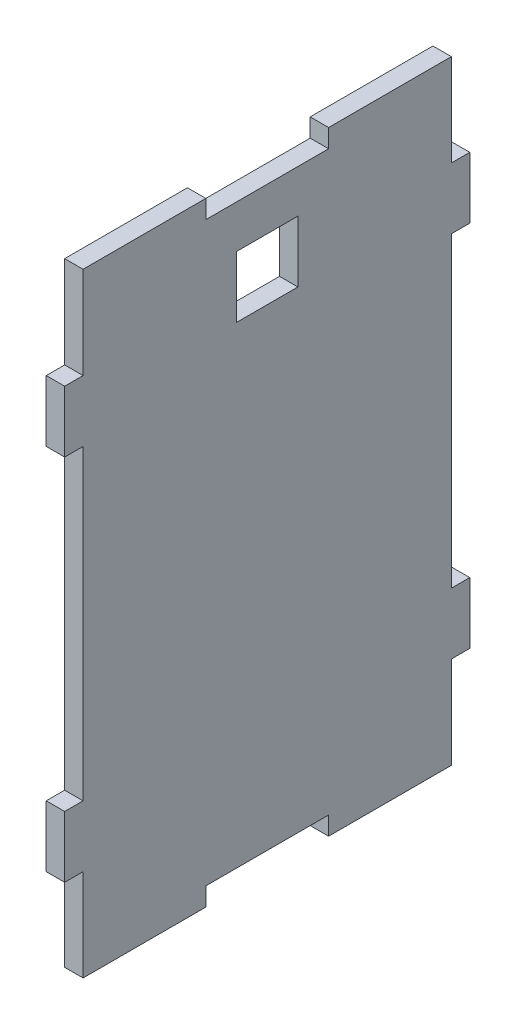
ISO-10303-21;
HEADER;
FILE_DESCRIPTION(('STEP AP214'),'2;1');
FILE_NAME('part.step','',(''),(''),'','','');
FILE_SCHEMA(('AUTOMOTIVE_DESIGN { 1 0 10303 214 1 1 1 1 }'));
ENDSEC;
DATA;
#1=APPLICATION_CONTEXT('core data for automotive mechanical design processes');
#2=APPLICATION_PROTOCOL_DEFINITION('international standard','automotive_design',2000,#1);
#3=PRODUCT_CONTEXT('',#1,'mechanical');
#4=PRODUCT('Part','Part','',(#3));
#5=PRODUCT_RELATED_PRODUCT_CATEGORY('part','',(#4));
#6=PRODUCT_DEFINITION_FORMATION('','',#4);
#7=PRODUCT_DEFINITION_CONTEXT('part definition',#1,'design');
#8=PRODUCT_DEFINITION('design','',#6,#7);
#9=PRODUCT_DEFINITION_SHAPE('','',#8);
#10=(LENGTH_UNIT() NAMED_UNIT(*) SI_UNIT(.MILLI.,.METRE.));
#11=(NAMED_UNIT(*) PLANE_ANGLE_UNIT() SI_UNIT($,.RADIAN.));
#12=(NAMED_UNIT(*) SI_UNIT($,.STERADIAN.) SOLID_ANGLE_UNIT());
#13=UNCERTAINTY_MEASURE_WITH_UNIT(LENGTH_MEASURE(1.E-05),#10,'distance_accuracy_value','');
#14=(GEOMETRIC_REPRESENTATION_CONTEXT(3) GLOBAL_UNCERTAINTY_ASSIGNED_CONTEXT((#13)) GLOBAL_UNIT_ASSIGNED_CONTEXT((#10,
#11,#12)) REPRESENTATION_CONTEXT('',''));
#15=CARTESIAN_POINT('',(0.,0.,0.));
#16=DIRECTION('',(0.,0.,1.));
#17=DIRECTION('',(1.,0.,0.));
#18=AXIS2_PLACEMENT_3D('',#15,#16,#17);
#19=CARTESIAN_POINT('',(3.,50.,30.));
#20=DIRECTION('',(0.,-1.,0.));
#21=DIRECTION('',(0.,0.,-1.));
#22=AXIS2_PLACEMENT_3D('',#19,#20,#21);
#23=PLANE('',#22);
#24=DIRECTION('',(0.,0.,1.));
#25=VECTOR('',#24,1.);
#26=CARTESIAN_POINT('',(0.,50.,30.));
#27=LINE('',#26,#25);
#28=CARTESIAN_POINT('',(0.,50.,-30.));
#29=VERTEX_POINT('',#28);
#30=CARTESIAN_POINT('',(0.,50.,-10.));
#31=VERTEX_POINT('',#30);
#32=EDGE_CURVE('E537',#29,#31,#27,.T.);
#33=ORIENTED_EDGE('',*,*,#32,.T.);
#34=DIRECTION('',(1.,0.,0.));
#35=VECTOR('',#34,1.);
#36=CARTESIAN_POINT('',(0.,50.,-10.));
#37=LINE('',#36,#35);
#38=CARTESIAN_POINT('',(3.,50.,-10.));
#39=VERTEX_POINT('',#38);
#40=EDGE_CURVE('E322',#31,#39,#37,.T.);
#41=ORIENTED_EDGE('',*,*,#40,.T.);
#42=DIRECTION('',(0.,0.,1.));
#43=VECTOR('',#42,1.);
#44=CARTESIAN_POINT('',(3.,50.,30.));
#45=LINE('',#44,#43);
#46=CARTESIAN_POINT('',(3.,50.,-30.));
#47=VERTEX_POINT('',#46);
#48=EDGE_CURVE('E516',#47,#39,#45,.T.);
#49=ORIENTED_EDGE('',*,*,#48,.F.);
#50=DIRECTION('',(-1.,0.,0.));
#51=VECTOR('',#50,1.);
#52=CARTESIAN_POINT('',(3.,50.,-30.));
#53=LINE('',#52,#51);
#54=EDGE_CURVE('E11',#47,#29,#53,.T.);
#55=ORIENTED_EDGE('',*,*,#54,.T.);
#56=EDGE_LOOP('',(#33,#41,#49,#55));
#57=FACE_BOUND('',#56,.T.);
#58=ADVANCED_FACE('F38',(#57),#23,.F.);
#59=CARTESIAN_POINT('',(3.,-50.,30.));
#60=DIRECTION('',(0.,1.,0.));
#61=DIRECTION('',(0.,0.,1.));
#62=AXIS2_PLACEMENT_3D('',#59,#60,#61);
#63=PLANE('',#62);
#64=DIRECTION('',(0.,0.,-1.));
#65=VECTOR('',#64,1.);
#66=CARTESIAN_POINT('',(0.,-50.,30.));
#67=LINE('',#66,#65);
#68=CARTESIAN_POINT('',(0.,-50.,30.));
#69=VERTEX_POINT('',#68);
#70=CARTESIAN_POINT('',(0.,-50.,10.));
#71=VERTEX_POINT('',#70);
#72=EDGE_CURVE('E547',#69,#71,#67,.T.);
#73=ORIENTED_EDGE('',*,*,#72,.T.);
#74=DIRECTION('',(1.,0.,0.));
#75=VECTOR('',#74,1.);
#76=CARTESIAN_POINT('',(0.,-50.,10.));
#77=LINE('',#76,#75);
#78=CARTESIAN_POINT('',(3.,-50.,10.));
#79=VERTEX_POINT('',#78);
#80=EDGE_CURVE('E316',#71,#79,#77,.T.);
#81=ORIENTED_EDGE('',*,*,#80,.T.);
#82=DIRECTION('',(0.,0.,-1.));
#83=VECTOR('',#82,1.);
#84=CARTESIAN_POINT('',(3.,-50.,30.));
#85=LINE('',#84,#83);
#86=CARTESIAN_POINT('',(3.,-50.,30.));
#87=VERTEX_POINT('',#86);
#88=EDGE_CURVE('E527',#87,#79,#85,.T.);
#89=ORIENTED_EDGE('',*,*,#88,.F.);
#90=DIRECTION('',(-1.,0.,0.));
#91=VECTOR('',#90,1.);
#92=CARTESIAN_POINT('',(3.,-50.,30.));
#93=LINE('',#92,#91);
#94=EDGE_CURVE('E554',#87,#69,#93,.T.);
#95=ORIENTED_EDGE('',*,*,#94,.T.);
#96=EDGE_LOOP('',(#73,#81,#89,#95));
#97=FACE_BOUND('',#96,.T.);
#98=ADVANCED_FACE('F654',(#97),#63,.F.);
#99=CARTESIAN_POINT('',(3.,50.,-30.));
#100=DIRECTION('',(0.,0.,1.));
#101=DIRECTION('',(0.,-1.,0.));
#102=AXIS2_PLACEMENT_3D('',#99,#100,#101);
#103=PLANE('',#102);
#104=DIRECTION('',(-1.,0.,0.));
#105=VECTOR('',#104,1.);
#106=CARTESIAN_POINT('',(3.,-35.,-30.));
#107=LINE('',#106,#105);
#108=CARTESIAN_POINT('',(3.,-35.,-30.));
#109=VERTEX_POINT('',#108);
#110=CARTESIAN_POINT('',(0.,-35.,-30.));
#111=VERTEX_POINT('',#110);
#112=EDGE_CURVE('E400',#109,#111,#107,.T.);
#113=ORIENTED_EDGE('',*,*,#112,.F.);
#114=DIRECTION('',(0.,1.,0.));
#115=VECTOR('',#114,1.);
#116=CARTESIAN_POINT('',(3.,50.,-30.));
#117=LINE('',#116,#115);
#118=CARTESIAN_POINT('',(3.,-50.,-30.));
#119=VERTEX_POINT('',#118);
#120=EDGE_CURVE('E509',#119,#109,#117,.T.);
#121=ORIENTED_EDGE('',*,*,#120,.F.);
#122=DIRECTION('',(-1.,0.,0.));
#123=VECTOR('',#122,1.);
#124=CARTESIAN_POINT('',(3.,-50.,-30.));
#125=LINE('',#124,#123);
#126=CARTESIAN_POINT('',(0.,-50.,-30.));
#127=VERTEX_POINT('',#126);
#128=EDGE_CURVE('E531',#119,#127,#125,.T.);
#129=ORIENTED_EDGE('',*,*,#128,.T.);
#130=DIRECTION('',(0.,1.,0.));
#131=VECTOR('',#130,1.);
#132=CARTESIAN_POINT('',(0.,50.,-30.));
#133=LINE('',#132,#131);
#134=EDGE_CURVE('E532',#127,#111,#133,.T.);
#135=ORIENTED_EDGE('',*,*,#134,.T.);
#136=EDGE_LOOP('',(#113,#121,#129,#135));
#137=FACE_BOUND('',#136,.T.);
#138=ADVANCED_FACE('F634',(#137),#103,.F.);
#139=DIRECTION('',(-1.,0.,0.));
#140=VECTOR('',#139,1.);
#141=CARTESIAN_POINT('',(3.,-25.,-30.));
#142=LINE('',#141,#140);
#143=CARTESIAN_POINT('',(3.,-25.,-30.));
#144=VERTEX_POINT('',#143);
#145=CARTESIAN_POINT('',(0.,-25.,-30.));
#146=VERTEX_POINT('',#145);
#147=EDGE_CURVE('E380',#144,#146,#142,.T.);
#148=ORIENTED_EDGE('',*,*,#147,.T.);
#149=CARTESIAN_POINT('',(0.,25.,-30.));
#150=VERTEX_POINT('',#149);
#151=EDGE_CURVE('E536',#146,#150,#133,.T.);
#152=ORIENTED_EDGE('',*,*,#151,.T.);
#153=DIRECTION('',(-1.,0.,0.));
#154=VECTOR('',#153,1.);
#155=CARTESIAN_POINT('',(3.,25.,-30.));
#156=LINE('',#155,#154);
#157=CARTESIAN_POINT('',(3.,25.,-30.));
#158=VERTEX_POINT('',#157);
#159=EDGE_CURVE('E434',#158,#150,#156,.T.);
#160=ORIENTED_EDGE('',*,*,#159,.F.);
#161=EDGE_CURVE('E514',#144,#158,#117,.T.);
#162=ORIENTED_EDGE('',*,*,#161,.F.);
#163=EDGE_LOOP('',(#148,#152,#160,#162));
#164=FACE_BOUND('',#163,.T.);
#165=ADVANCED_FACE('F615',(#164),#103,.F.);
#166=CARTESIAN_POINT('',(3.,50.,30.));
#167=DIRECTION('',(0.,0.,-1.));
#168=DIRECTION('',(0.,1.,0.));
#169=AXIS2_PLACEMENT_3D('',#166,#167,#168);
#170=PLANE('',#169);
#171=DIRECTION('',(-1.,0.,0.));
#172=VECTOR('',#171,1.);
#173=CARTESIAN_POINT('',(3.,35.,30.));
#174=LINE('',#173,#172);
#175=CARTESIAN_POINT('',(3.,35.,30.));
#176=VERTEX_POINT('',#175);
#177=CARTESIAN_POINT('',(0.,35.,30.));
#178=VERTEX_POINT('',#177);
#179=EDGE_CURVE('E470',#176,#178,#174,.T.);
#180=ORIENTED_EDGE('',*,*,#179,.F.);
#181=DIRECTION('',(0.,-1.,0.));
#182=VECTOR('',#181,1.);
#183=CARTESIAN_POINT('',(3.,50.,30.));
#184=LINE('',#183,#182);
#185=CARTESIAN_POINT('',(3.,50.,30.));
#186=VERTEX_POINT('',#185);
#187=EDGE_CURVE('E521',#186,#176,#184,.T.);
#188=ORIENTED_EDGE('',*,*,#187,.F.);
#189=DIRECTION('',(-1.,0.,0.));
#190=VECTOR('',#189,1.);
#191=CARTESIAN_POINT('',(3.,50.,30.));
#192=LINE('',#191,#190);
#193=CARTESIAN_POINT('',(0.,50.,30.));
#194=VERTEX_POINT('',#193);
#195=EDGE_CURVE('E47',#186,#194,#192,.T.);
#196=ORIENTED_EDGE('',*,*,#195,.T.);
#197=DIRECTION('',(0.,-1.,0.));
#198=VECTOR('',#197,1.);
#199=CARTESIAN_POINT('',(0.,50.,30.));
#200=LINE('',#199,#198);
#201=EDGE_CURVE('E542',#194,#178,#200,.T.);
#202=ORIENTED_EDGE('',*,*,#201,.T.);
#203=EDGE_LOOP('',(#180,#188,#196,#202));
#204=FACE_BOUND('',#203,.T.);
#205=ADVANCED_FACE('F563',(#204),#170,.F.);
#206=DIRECTION('',(-1.,0.,0.));
#207=VECTOR('',#206,1.);
#208=CARTESIAN_POINT('',(3.,25.,30.));
#209=LINE('',#208,#207);
#210=CARTESIAN_POINT('',(3.,25.,30.));
#211=VERTEX_POINT('',#210);
#212=CARTESIAN_POINT('',(0.,25.,30.));
#213=VERTEX_POINT('',#212);
#214=EDGE_CURVE('E450',#211,#213,#209,.T.);
#215=ORIENTED_EDGE('',*,*,#214,.T.);
#216=CARTESIAN_POINT('',(0.,-25.,30.));
#217=VERTEX_POINT('',#216);
#218=EDGE_CURVE('E546',#213,#217,#200,.T.);
#219=ORIENTED_EDGE('',*,*,#218,.T.);
#220=DIRECTION('',(-1.,0.,0.));
#221=VECTOR('',#220,1.);
#222=CARTESIAN_POINT('',(3.,-25.,30.));
#223=LINE('',#222,#221);
#224=CARTESIAN_POINT('',(3.,-25.,30.));
#225=VERTEX_POINT('',#224);
#226=EDGE_CURVE('E504',#225,#217,#223,.T.);
#227=ORIENTED_EDGE('',*,*,#226,.F.);
#228=EDGE_CURVE('E526',#211,#225,#184,.T.);
#229=ORIENTED_EDGE('',*,*,#228,.F.);
#230=EDGE_LOOP('',(#215,#219,#227,#229));
#231=FACE_BOUND('',#230,.T.);
#232=ADVANCED_FACE('F678',(#231),#170,.F.);
#233=CARTESIAN_POINT('',(3.,35.,-30.));
#234=VERTEX_POINT('',#233);
#235=EDGE_CURVE('E515',#234,#47,#117,.T.);
#236=ORIENTED_EDGE('',*,*,#235,.F.);
#237=DIRECTION('',(-1.,0.,0.));
#238=VECTOR('',#237,1.);
#239=CARTESIAN_POINT('',(3.,35.,-30.));
#240=LINE('',#239,#238);
#241=CARTESIAN_POINT('',(0.,35.,-30.));
#242=VERTEX_POINT('',#241);
#243=EDGE_CURVE('E415',#234,#242,#240,.T.);
#244=ORIENTED_EDGE('',*,*,#243,.T.);
#245=EDGE_CURVE('E508',#242,#29,#133,.T.);
#246=ORIENTED_EDGE('',*,*,#245,.T.);
#247=ORIENTED_EDGE('',*,*,#54,.F.);
#248=EDGE_LOOP('',(#236,#244,#246,#247));
#249=FACE_BOUND('',#248,.T.);
#250=ADVANCED_FACE('F40',(#249),#103,.F.);
#251=CARTESIAN_POINT('',(3.,50.,10.));
#252=VERTEX_POINT('',#251);
#253=EDGE_CURVE('E513',#252,#186,#45,.T.);
#254=ORIENTED_EDGE('',*,*,#253,.F.);
#255=DIRECTION('',(1.,0.,0.));
#256=VECTOR('',#255,1.);
#257=CARTESIAN_POINT('',(0.,50.,10.));
#258=LINE('',#257,#256);
#259=CARTESIAN_POINT('',(0.,50.,10.));
#260=VERTEX_POINT('',#259);
#261=EDGE_CURVE('E310',#260,#252,#258,.T.);
#262=ORIENTED_EDGE('',*,*,#261,.F.);
#263=EDGE_CURVE('E535',#260,#194,#27,.T.);
#264=ORIENTED_EDGE('',*,*,#263,.T.);
#265=ORIENTED_EDGE('',*,*,#195,.F.);
#266=EDGE_LOOP('',(#254,#262,#264,#265));
#267=FACE_BOUND('',#266,.T.);
#268=ADVANCED_FACE('F697',(#267),#23,.F.);
#269=CARTESIAN_POINT('',(3.,-35.,30.));
#270=VERTEX_POINT('',#269);
#271=EDGE_CURVE('E520',#270,#87,#184,.T.);
#272=ORIENTED_EDGE('',*,*,#271,.F.);
#273=DIRECTION('',(-1.,0.,0.));
#274=VECTOR('',#273,1.);
#275=CARTESIAN_POINT('',(3.,-35.,30.));
#276=LINE('',#275,#274);
#277=CARTESIAN_POINT('',(0.,-35.,30.));
#278=VERTEX_POINT('',#277);
#279=EDGE_CURVE('E485',#270,#278,#276,.T.);
#280=ORIENTED_EDGE('',*,*,#279,.T.);
#281=EDGE_CURVE('E541',#278,#69,#200,.T.);
#282=ORIENTED_EDGE('',*,*,#281,.T.);
#283=ORIENTED_EDGE('',*,*,#94,.F.);
#284=EDGE_LOOP('',(#272,#280,#282,#283));
#285=FACE_BOUND('',#284,.T.);
#286=ADVANCED_FACE('F659',(#285),#170,.F.);
#287=CARTESIAN_POINT('',(3.,-50.,-10.));
#288=VERTEX_POINT('',#287);
#289=EDGE_CURVE('E525',#288,#119,#85,.T.);
#290=ORIENTED_EDGE('',*,*,#289,.F.);
#291=DIRECTION('',(1.,0.,0.));
#292=VECTOR('',#291,1.);
#293=CARTESIAN_POINT('',(0.,-50.,-10.));
#294=LINE('',#293,#292);
#295=CARTESIAN_POINT('',(0.,-50.,-10.));
#296=VERTEX_POINT('',#295);
#297=EDGE_CURVE('E348',#296,#288,#294,.T.);
#298=ORIENTED_EDGE('',*,*,#297,.F.);
#299=EDGE_CURVE('E545',#296,#127,#67,.T.);
#300=ORIENTED_EDGE('',*,*,#299,.T.);
#301=ORIENTED_EDGE('',*,*,#128,.F.);
#302=EDGE_LOOP('',(#290,#298,#300,#301));
#303=FACE_BOUND('',#302,.T.);
#304=ADVANCED_FACE('F639',(#303),#63,.F.);
#305=CARTESIAN_POINT('',(3.,0.,0.));
#306=DIRECTION('',(1.,0.,0.));
#307=DIRECTION('',(0.,0.,-1.));
#308=AXIS2_PLACEMENT_3D('',#305,#306,#307);
#309=PLANE('',#308);
#310=DIRECTION('',(0.,1.,0.));
#311=VECTOR('',#310,1.);
#312=CARTESIAN_POINT('',(3.,40.,-5.));
#313=LINE('',#312,#311);
#314=CARTESIAN_POINT('',(3.,30.,-5.));
#315=VERTEX_POINT('',#314);
#316=CARTESIAN_POINT('',(3.,40.,-5.));
#317=VERTEX_POINT('',#316);
#318=EDGE_CURVE('E54',#315,#317,#313,.T.);
#319=ORIENTED_EDGE('',*,*,#318,.F.);
#320=DIRECTION('',(0.,0.,-1.));
#321=VECTOR('',#320,1.);
#322=CARTESIAN_POINT('',(3.,30.,5.));
#323=LINE('',#322,#321);
#324=CARTESIAN_POINT('',(3.,30.,5.));
#325=VERTEX_POINT('',#324);
#326=EDGE_CURVE('E269',#325,#315,#323,.T.);
#327=ORIENTED_EDGE('',*,*,#326,.F.);
#328=DIRECTION('',(0.,-1.,0.));
#329=VECTOR('',#328,1.);
#330=CARTESIAN_POINT('',(3.,40.,5.));
#331=LINE('',#330,#329);
#332=CARTESIAN_POINT('',(3.,40.,5.));
#333=VERTEX_POINT('',#332);
#334=EDGE_CURVE('E273',#333,#325,#331,.T.);
#335=ORIENTED_EDGE('',*,*,#334,.F.);
#336=DIRECTION('',(0.,0.,1.));
#337=VECTOR('',#336,1.);
#338=CARTESIAN_POINT('',(3.,40.,5.));
#339=LINE('',#338,#337);
#340=EDGE_CURVE('E282',#317,#333,#339,.T.);
#341=ORIENTED_EDGE('',*,*,#340,.F.);
#342=EDGE_LOOP('',(#319,#327,#335,#341));
#343=FACE_BOUND('',#342,.T.);
#344=DIRECTION('',(0.,1.,0.));
#345=VECTOR('',#344,1.);
#346=CARTESIAN_POINT('',(3.,47.,-10.));
#347=LINE('',#346,#345);
#348=CARTESIAN_POINT('',(3.,47.,-10.));
#349=VERTEX_POINT('',#348);
#350=EDGE_CURVE('E302',#349,#39,#347,.T.);
#351=ORIENTED_EDGE('',*,*,#350,.F.);
#352=DIRECTION('',(0.,0.,-1.));
#353=VECTOR('',#352,1.);
#354=CARTESIAN_POINT('',(3.,47.,10.));
#355=LINE('',#354,#353);
#356=CARTESIAN_POINT('',(3.,47.,10.));
#357=VERTEX_POINT('',#356);
#358=EDGE_CURVE('E315',#357,#349,#355,.T.);
#359=ORIENTED_EDGE('',*,*,#358,.F.);
#360=DIRECTION('',(0.,-1.,0.));
#361=VECTOR('',#360,1.);
#362=CARTESIAN_POINT('',(3.,50.,10.));
#363=LINE('',#362,#361);
#364=EDGE_CURVE('E311',#252,#357,#363,.T.);
#365=ORIENTED_EDGE('',*,*,#364,.F.);
#366=ORIENTED_EDGE('',*,*,#253,.T.);
#367=ORIENTED_EDGE('',*,*,#187,.T.);
#368=DIRECTION('',(0.,0.,1.));
#369=VECTOR('',#368,1.);
#370=CARTESIAN_POINT('',(3.,35.,33.));
#371=LINE('',#370,#369);
#372=CARTESIAN_POINT('',(3.,35.,33.));
#373=VERTEX_POINT('',#372);
#374=EDGE_CURVE('E439',#176,#373,#371,.T.);
#375=ORIENTED_EDGE('',*,*,#374,.T.);
#376=DIRECTION('',(0.,-1.,0.));
#377=VECTOR('',#376,1.);
#378=CARTESIAN_POINT('',(3.,25.,33.));
#379=LINE('',#378,#377);
#380=CARTESIAN_POINT('',(3.,25.,33.));
#381=VERTEX_POINT('',#380);
#382=EDGE_CURVE('E442',#373,#381,#379,.T.);
#383=ORIENTED_EDGE('',*,*,#382,.T.);
#384=DIRECTION('',(0.,0.,-1.));
#385=VECTOR('',#384,1.);
#386=CARTESIAN_POINT('',(3.,25.,30.));
#387=LINE('',#386,#385);
#388=EDGE_CURVE('E446',#381,#211,#387,.T.);
#389=ORIENTED_EDGE('',*,*,#388,.T.);
#390=ORIENTED_EDGE('',*,*,#228,.T.);
#391=DIRECTION('',(0.,0.,1.));
#392=VECTOR('',#391,1.);
#393=CARTESIAN_POINT('',(3.,-25.,33.));
#394=LINE('',#393,#392);
#395=CARTESIAN_POINT('',(3.,-25.,33.));
#396=VERTEX_POINT('',#395);
#397=EDGE_CURVE('E475',#225,#396,#394,.T.);
#398=ORIENTED_EDGE('',*,*,#397,.T.);
#399=DIRECTION('',(0.,-1.,0.));
#400=VECTOR('',#399,1.);
#401=CARTESIAN_POINT('',(3.,-35.,33.));
#402=LINE('',#401,#400);
#403=CARTESIAN_POINT('',(3.,-35.,33.));
#404=VERTEX_POINT('',#403);
#405=EDGE_CURVE('E478',#396,#404,#402,.T.);
#406=ORIENTED_EDGE('',*,*,#405,.T.);
#407=DIRECTION('',(0.,0.,-1.));
#408=VECTOR('',#407,1.);
#409=CARTESIAN_POINT('',(3.,-35.,30.));
#410=LINE('',#409,#408);
#411=EDGE_CURVE('E482',#404,#270,#410,.T.);
#412=ORIENTED_EDGE('',*,*,#411,.T.);
#413=ORIENTED_EDGE('',*,*,#271,.T.);
#414=ORIENTED_EDGE('',*,*,#88,.T.);
#415=DIRECTION('',(0.,-1.,0.));
#416=VECTOR('',#415,1.);
#417=CARTESIAN_POINT('',(3.,-50.,10.));
#418=LINE('',#417,#416);
#419=CARTESIAN_POINT('',(3.,-47.,10.));
#420=VERTEX_POINT('',#419);
#421=EDGE_CURVE('E340',#420,#79,#418,.T.);
#422=ORIENTED_EDGE('',*,*,#421,.F.);
#423=DIRECTION('',(0.,0.,1.));
#424=VECTOR('',#423,1.);
#425=CARTESIAN_POINT('',(3.,-47.,10.));
#426=LINE('',#425,#424);
#427=CARTESIAN_POINT('',(3.,-47.,-10.));
#428=VERTEX_POINT('',#427);
#429=EDGE_CURVE('E352',#428,#420,#426,.T.);
#430=ORIENTED_EDGE('',*,*,#429,.F.);
#431=DIRECTION('',(0.,1.,0.));
#432=VECTOR('',#431,1.);
#433=CARTESIAN_POINT('',(3.,-47.,-10.));
#434=LINE('',#433,#432);
#435=EDGE_CURVE('E291',#288,#428,#434,.T.);
#436=ORIENTED_EDGE('',*,*,#435,.F.);
#437=ORIENTED_EDGE('',*,*,#289,.T.);
#438=ORIENTED_EDGE('',*,*,#120,.T.);
#439=DIRECTION('',(0.,0.,-1.));
#440=VECTOR('',#439,1.);
#441=CARTESIAN_POINT('',(3.,-35.,-30.));
#442=LINE('',#441,#440);
#443=CARTESIAN_POINT('',(3.,-35.,-33.));
#444=VERTEX_POINT('',#443);
#445=EDGE_CURVE('E369',#109,#444,#442,.T.);
#446=ORIENTED_EDGE('',*,*,#445,.T.);
#447=DIRECTION('',(0.,1.,0.));
#448=VECTOR('',#447,1.);
#449=CARTESIAN_POINT('',(3.,-35.,-33.));
#450=LINE('',#449,#448);
#451=CARTESIAN_POINT('',(3.,-25.,-33.));
#452=VERTEX_POINT('',#451);
#453=EDGE_CURVE('E372',#444,#452,#450,.T.);
#454=ORIENTED_EDGE('',*,*,#453,.T.);
#455=DIRECTION('',(0.,0.,1.));
#456=VECTOR('',#455,1.);
#457=CARTESIAN_POINT('',(3.,-25.,-33.));
#458=LINE('',#457,#456);
#459=EDGE_CURVE('E376',#452,#144,#458,.T.);
#460=ORIENTED_EDGE('',*,*,#459,.T.);
#461=ORIENTED_EDGE('',*,*,#161,.T.);
#462=DIRECTION('',(0.,0.,-1.));
#463=VECTOR('',#462,1.);
#464=CARTESIAN_POINT('',(3.,25.,-33.));
#465=LINE('',#464,#463);
#466=CARTESIAN_POINT('',(3.,25.,-33.));
#467=VERTEX_POINT('',#466);
#468=EDGE_CURVE('E405',#158,#467,#465,.T.);
#469=ORIENTED_EDGE('',*,*,#468,.T.);
#470=DIRECTION('',(0.,1.,0.));
#471=VECTOR('',#470,1.);
#472=CARTESIAN_POINT('',(3.,35.,-33.));
#473=LINE('',#472,#471);
#474=CARTESIAN_POINT('',(3.,35.,-33.));
#475=VERTEX_POINT('',#474);
#476=EDGE_CURVE('E408',#467,#475,#473,.T.);
#477=ORIENTED_EDGE('',*,*,#476,.T.);
#478=DIRECTION('',(0.,0.,1.));
#479=VECTOR('',#478,1.);
#480=CARTESIAN_POINT('',(3.,35.,-30.));
#481=LINE('',#480,#479);
#482=EDGE_CURVE('E412',#475,#234,#481,.T.);
#483=ORIENTED_EDGE('',*,*,#482,.T.);
#484=ORIENTED_EDGE('',*,*,#235,.T.);
#485=ORIENTED_EDGE('',*,*,#48,.T.);
#486=EDGE_LOOP('',(#351,#359,#365,#366,#367,#375,#383,#389,#390,#398,#406,#412,#413,#414,#422,
#430,#436,#437,#438,#446,#454,#460,#461,#469,#477,#483,#484,#485));
#487=FACE_BOUND('',#486,.T.);
#488=ADVANCED_FACE('F576',(#343,#487),#309,.T.);
#489=CARTESIAN_POINT('',(0.,0.,0.));
#490=DIRECTION('',(1.,0.,0.));
#491=DIRECTION('',(0.,0.,-1.));
#492=AXIS2_PLACEMENT_3D('',#489,#490,#491);
#493=PLANE('',#492);
#494=DIRECTION('',(0.,0.,-1.));
#495=VECTOR('',#494,1.);
#496=CARTESIAN_POINT('',(0.,30.,5.));
#497=LINE('',#496,#495);
#498=CARTESIAN_POINT('',(0.,30.,5.));
#499=VERTEX_POINT('',#498);
#500=CARTESIAN_POINT('',(0.,30.,-5.));
#501=VERTEX_POINT('',#500);
#502=EDGE_CURVE('E257',#499,#501,#497,.T.);
#503=ORIENTED_EDGE('',*,*,#502,.T.);
#504=DIRECTION('',(0.,1.,0.));
#505=VECTOR('',#504,1.);
#506=CARTESIAN_POINT('',(0.,40.,-5.));
#507=LINE('',#506,#505);
#508=CARTESIAN_POINT('',(0.,40.,-5.));
#509=VERTEX_POINT('',#508);
#510=EDGE_CURVE('E250',#501,#509,#507,.T.);
#511=ORIENTED_EDGE('',*,*,#510,.T.);
#512=DIRECTION('',(0.,0.,1.));
#513=VECTOR('',#512,1.);
#514=CARTESIAN_POINT('',(0.,40.,5.));
#515=LINE('',#514,#513);
#516=CARTESIAN_POINT('',(0.,40.,5.));
#517=VERTEX_POINT('',#516);
#518=EDGE_CURVE('E260',#509,#517,#515,.T.);
#519=ORIENTED_EDGE('',*,*,#518,.T.);
#520=DIRECTION('',(0.,-1.,0.));
#521=VECTOR('',#520,1.);
#522=CARTESIAN_POINT('',(0.,40.,5.));
#523=LINE('',#522,#521);
#524=EDGE_CURVE('E62',#517,#499,#523,.T.);
#525=ORIENTED_EDGE('',*,*,#524,.T.);
#526=EDGE_LOOP('',(#503,#511,#519,#525));
#527=FACE_BOUND('',#526,.T.);
#528=DIRECTION('',(0.,0.,-1.));
#529=VECTOR('',#528,1.);
#530=CARTESIAN_POINT('',(0.,47.,10.));
#531=LINE('',#530,#529);
#532=CARTESIAN_POINT('',(0.,47.,10.));
#533=VERTEX_POINT('',#532);
#534=CARTESIAN_POINT('',(0.,47.,-10.));
#535=VERTEX_POINT('',#534);
#536=EDGE_CURVE('E301',#533,#535,#531,.T.);
#537=ORIENTED_EDGE('',*,*,#536,.T.);
#538=DIRECTION('',(0.,1.,0.));
#539=VECTOR('',#538,1.);
#540=CARTESIAN_POINT('',(0.,47.,-10.));
#541=LINE('',#540,#539);
#542=EDGE_CURVE('E306',#535,#31,#541,.T.);
#543=ORIENTED_EDGE('',*,*,#542,.T.);
#544=ORIENTED_EDGE('',*,*,#32,.F.);
#545=ORIENTED_EDGE('',*,*,#245,.F.);
#546=DIRECTION('',(0.,0.,1.));
#547=VECTOR('',#546,1.);
#548=CARTESIAN_POINT('',(0.,35.,-30.));
#549=LINE('',#548,#547);
#550=CARTESIAN_POINT('',(0.,35.,-33.));
#551=VERTEX_POINT('',#550);
#552=EDGE_CURVE('E409',#551,#242,#549,.T.);
#553=ORIENTED_EDGE('',*,*,#552,.F.);
#554=DIRECTION('',(0.,1.,0.));
#555=VECTOR('',#554,1.);
#556=CARTESIAN_POINT('',(0.,35.,-33.));
#557=LINE('',#556,#555);
#558=CARTESIAN_POINT('',(0.,25.,-33.));
#559=VERTEX_POINT('',#558);
#560=EDGE_CURVE('E418',#559,#551,#557,.T.);
#561=ORIENTED_EDGE('',*,*,#560,.F.);
#562=DIRECTION('',(0.,0.,-1.));
#563=VECTOR('',#562,1.);
#564=CARTESIAN_POINT('',(0.,25.,-33.));
#565=LINE('',#564,#563);
#566=EDGE_CURVE('E404',#150,#559,#565,.T.);
#567=ORIENTED_EDGE('',*,*,#566,.F.);
#568=ORIENTED_EDGE('',*,*,#151,.F.);
#569=DIRECTION('',(0.,0.,1.));
#570=VECTOR('',#569,1.);
#571=CARTESIAN_POINT('',(0.,-25.,-33.));
#572=LINE('',#571,#570);
#573=CARTESIAN_POINT('',(0.,-25.,-33.));
#574=VERTEX_POINT('',#573);
#575=EDGE_CURVE('E373',#574,#146,#572,.T.);
#576=ORIENTED_EDGE('',*,*,#575,.F.);
#577=DIRECTION('',(0.,1.,0.));
#578=VECTOR('',#577,1.);
#579=CARTESIAN_POINT('',(0.,-35.,-33.));
#580=LINE('',#579,#578);
#581=CARTESIAN_POINT('',(0.,-35.,-33.));
#582=VERTEX_POINT('',#581);
#583=EDGE_CURVE('E383',#582,#574,#580,.T.);
#584=ORIENTED_EDGE('',*,*,#583,.F.);
#585=DIRECTION('',(0.,0.,-1.));
#586=VECTOR('',#585,1.);
#587=CARTESIAN_POINT('',(0.,-35.,-30.));
#588=LINE('',#587,#586);
#589=EDGE_CURVE('E326',#111,#582,#588,.T.);
#590=ORIENTED_EDGE('',*,*,#589,.F.);
#591=ORIENTED_EDGE('',*,*,#134,.F.);
#592=ORIENTED_EDGE('',*,*,#299,.F.);
#593=DIRECTION('',(0.,1.,0.));
#594=VECTOR('',#593,1.);
#595=CARTESIAN_POINT('',(0.,-47.,-10.));
#596=LINE('',#595,#594);
#597=CARTESIAN_POINT('',(0.,-47.,-10.));
#598=VERTEX_POINT('',#597);
#599=EDGE_CURVE('E335',#296,#598,#596,.T.);
#600=ORIENTED_EDGE('',*,*,#599,.T.);
#601=DIRECTION('',(0.,0.,1.));
#602=VECTOR('',#601,1.);
#603=CARTESIAN_POINT('',(0.,-47.,10.));
#604=LINE('',#603,#602);
#605=CARTESIAN_POINT('',(0.,-47.,10.));
#606=VERTEX_POINT('',#605);
#607=EDGE_CURVE('E339',#598,#606,#604,.T.);
#608=ORIENTED_EDGE('',*,*,#607,.T.);
#609=DIRECTION('',(0.,-1.,0.));
#610=VECTOR('',#609,1.);
#611=CARTESIAN_POINT('',(0.,-50.,10.));
#612=LINE('',#611,#610);
#613=EDGE_CURVE('E344',#606,#71,#612,.T.);
#614=ORIENTED_EDGE('',*,*,#613,.T.);
#615=ORIENTED_EDGE('',*,*,#72,.F.);
#616=ORIENTED_EDGE('',*,*,#281,.F.);
#617=DIRECTION('',(0.,0.,-1.));
#618=VECTOR('',#617,1.);
#619=CARTESIAN_POINT('',(0.,-35.,30.));
#620=LINE('',#619,#618);
#621=CARTESIAN_POINT('',(0.,-35.,33.));
#622=VERTEX_POINT('',#621);
#623=EDGE_CURVE('E479',#622,#278,#620,.T.);
#624=ORIENTED_EDGE('',*,*,#623,.F.);
#625=DIRECTION('',(0.,-1.,0.));
#626=VECTOR('',#625,1.);
#627=CARTESIAN_POINT('',(0.,-35.,33.));
#628=LINE('',#627,#626);
#629=CARTESIAN_POINT('',(0.,-25.,33.));
#630=VERTEX_POINT('',#629);
#631=EDGE_CURVE('E488',#630,#622,#628,.T.);
#632=ORIENTED_EDGE('',*,*,#631,.F.);
#633=DIRECTION('',(0.,0.,1.));
#634=VECTOR('',#633,1.);
#635=CARTESIAN_POINT('',(0.,-25.,33.));
#636=LINE('',#635,#634);
#637=EDGE_CURVE('E474',#217,#630,#636,.T.);
#638=ORIENTED_EDGE('',*,*,#637,.F.);
#639=ORIENTED_EDGE('',*,*,#218,.F.);
#640=DIRECTION('',(0.,0.,-1.));
#641=VECTOR('',#640,1.);
#642=CARTESIAN_POINT('',(0.,25.,30.));
#643=LINE('',#642,#641);
#644=CARTESIAN_POINT('',(0.,25.,33.));
#645=VERTEX_POINT('',#644);
#646=EDGE_CURVE('E443',#645,#213,#643,.T.);
#647=ORIENTED_EDGE('',*,*,#646,.F.);
#648=DIRECTION('',(0.,-1.,0.));
#649=VECTOR('',#648,1.);
#650=CARTESIAN_POINT('',(0.,25.,33.));
#651=LINE('',#650,#649);
#652=CARTESIAN_POINT('',(0.,35.,33.));
#653=VERTEX_POINT('',#652);
#654=EDGE_CURVE('E453',#653,#645,#651,.T.);
#655=ORIENTED_EDGE('',*,*,#654,.F.);
#656=DIRECTION('',(0.,0.,1.));
#657=VECTOR('',#656,1.);
#658=CARTESIAN_POINT('',(0.,35.,33.));
#659=LINE('',#658,#657);
#660=EDGE_CURVE('E438',#178,#653,#659,.T.);
#661=ORIENTED_EDGE('',*,*,#660,.F.);
#662=ORIENTED_EDGE('',*,*,#201,.F.);
#663=ORIENTED_EDGE('',*,*,#263,.F.);
#664=DIRECTION('',(0.,-1.,0.));
#665=VECTOR('',#664,1.);
#666=CARTESIAN_POINT('',(0.,50.,10.));
#667=LINE('',#666,#665);
#668=EDGE_CURVE('E297',#260,#533,#667,.T.);
#669=ORIENTED_EDGE('',*,*,#668,.T.);
#670=EDGE_LOOP('',(#537,#543,#544,#545,#553,#561,#567,#568,#576,#584,#590,#591,#592,#600,#608,
#614,#615,#616,#624,#632,#638,#639,#647,#655,#661,#662,#663,#669));
#671=FACE_BOUND('',#670,.T.);
#672=ADVANCED_FACE('F265',(#527,#671),#493,.F.);
#673=CARTESIAN_POINT('',(3.,-25.,33.));
#674=DIRECTION('',(0.,-1.,0.));
#675=DIRECTION('',(0.,0.,-1.));
#676=AXIS2_PLACEMENT_3D('',#673,#674,#675);
#677=PLANE('',#676);
#678=ORIENTED_EDGE('',*,*,#637,.T.);
#679=DIRECTION('',(-1.,0.,0.));
#680=VECTOR('',#679,1.);
#681=CARTESIAN_POINT('',(3.,-25.,33.));
#682=LINE('',#681,#680);
#683=EDGE_CURVE('E500',#396,#630,#682,.T.);
#684=ORIENTED_EDGE('',*,*,#683,.F.);
#685=ORIENTED_EDGE('',*,*,#397,.F.);
#686=ORIENTED_EDGE('',*,*,#226,.T.);
#687=EDGE_LOOP('',(#678,#684,#685,#686));
#688=FACE_BOUND('',#687,.T.);
#689=ADVANCED_FACE('F674',(#688),#677,.F.);
#690=CARTESIAN_POINT('',(3.,-35.,33.));
#691=DIRECTION('',(0.,0.,-1.));
#692=DIRECTION('',(-1.,0.,0.));
#693=AXIS2_PLACEMENT_3D('',#690,#691,#692);
#694=PLANE('',#693);
#695=ORIENTED_EDGE('',*,*,#631,.T.);
#696=DIRECTION('',(-1.,0.,0.));
#697=VECTOR('',#696,1.);
#698=CARTESIAN_POINT('',(3.,-35.,33.));
#699=LINE('',#698,#697);
#700=EDGE_CURVE('E496',#404,#622,#699,.T.);
#701=ORIENTED_EDGE('',*,*,#700,.F.);
#702=ORIENTED_EDGE('',*,*,#405,.F.);
#703=ORIENTED_EDGE('',*,*,#683,.T.);
#704=EDGE_LOOP('',(#695,#701,#702,#703));
#705=FACE_BOUND('',#704,.T.);
#706=ADVANCED_FACE('F670',(#705),#694,.F.);
#707=CARTESIAN_POINT('',(3.,-35.,30.));
#708=DIRECTION('',(0.,1.,0.));
#709=DIRECTION('',(0.,0.,1.));
#710=AXIS2_PLACEMENT_3D('',#707,#708,#709);
#711=PLANE('',#710);
#712=ORIENTED_EDGE('',*,*,#623,.T.);
#713=ORIENTED_EDGE('',*,*,#279,.F.);
#714=ORIENTED_EDGE('',*,*,#411,.F.);
#715=ORIENTED_EDGE('',*,*,#700,.T.);
#716=EDGE_LOOP('',(#712,#713,#714,#715));
#717=FACE_BOUND('',#716,.T.);
#718=ADVANCED_FACE('F665',(#717),#711,.F.);
#719=CARTESIAN_POINT('',(3.,35.,33.));
#720=DIRECTION('',(0.,-1.,0.));
#721=DIRECTION('',(0.,0.,-1.));
#722=AXIS2_PLACEMENT_3D('',#719,#720,#721);
#723=PLANE('',#722);
#724=ORIENTED_EDGE('',*,*,#660,.T.);
#725=DIRECTION('',(-1.,0.,0.));
#726=VECTOR('',#725,1.);
#727=CARTESIAN_POINT('',(3.,35.,33.));
#728=LINE('',#727,#726);
#729=EDGE_CURVE('E466',#373,#653,#728,.T.);
#730=ORIENTED_EDGE('',*,*,#729,.F.);
#731=ORIENTED_EDGE('',*,*,#374,.F.);
#732=ORIENTED_EDGE('',*,*,#179,.T.);
#733=EDGE_LOOP('',(#724,#730,#731,#732));
#734=FACE_BOUND('',#733,.T.);
#735=ADVANCED_FACE('F573',(#734),#723,.F.);
#736=CARTESIAN_POINT('',(3.,25.,33.));
#737=DIRECTION('',(0.,0.,-1.));
#738=DIRECTION('',(-1.,0.,0.));
#739=AXIS2_PLACEMENT_3D('',#736,#737,#738);
#740=PLANE('',#739);
#741=ORIENTED_EDGE('',*,*,#654,.T.);
#742=DIRECTION('',(-1.,0.,0.));
#743=VECTOR('',#742,1.);
#744=CARTESIAN_POINT('',(3.,25.,33.));
#745=LINE('',#744,#743);
#746=EDGE_CURVE('E462',#381,#645,#745,.T.);
#747=ORIENTED_EDGE('',*,*,#746,.F.);
#748=ORIENTED_EDGE('',*,*,#382,.F.);
#749=ORIENTED_EDGE('',*,*,#729,.T.);
#750=EDGE_LOOP('',(#741,#747,#748,#749));
#751=FACE_BOUND('',#750,.T.);
#752=ADVANCED_FACE('F685',(#751),#740,.F.);
#753=CARTESIAN_POINT('',(3.,25.,30.));
#754=DIRECTION('',(0.,1.,0.));
#755=DIRECTION('',(0.,0.,1.));
#756=AXIS2_PLACEMENT_3D('',#753,#754,#755);
#757=PLANE('',#756);
#758=ORIENTED_EDGE('',*,*,#646,.T.);
#759=ORIENTED_EDGE('',*,*,#214,.F.);
#760=ORIENTED_EDGE('',*,*,#388,.F.);
#761=ORIENTED_EDGE('',*,*,#746,.T.);
#762=EDGE_LOOP('',(#758,#759,#760,#761));
#763=FACE_BOUND('',#762,.T.);
#764=ADVANCED_FACE('F681',(#763),#757,.F.);
#765=CARTESIAN_POINT('',(3.,25.,-33.));
#766=DIRECTION('',(0.,1.,0.));
#767=DIRECTION('',(0.,0.,1.));
#768=AXIS2_PLACEMENT_3D('',#765,#766,#767);
#769=PLANE('',#768);
#770=ORIENTED_EDGE('',*,*,#566,.T.);
#771=DIRECTION('',(-1.,0.,0.));
#772=VECTOR('',#771,1.);
#773=CARTESIAN_POINT('',(3.,25.,-33.));
#774=LINE('',#773,#772);
#775=EDGE_CURVE('E430',#467,#559,#774,.T.);
#776=ORIENTED_EDGE('',*,*,#775,.F.);
#777=ORIENTED_EDGE('',*,*,#468,.F.);
#778=ORIENTED_EDGE('',*,*,#159,.T.);
#779=EDGE_LOOP('',(#770,#776,#777,#778));
#780=FACE_BOUND('',#779,.T.);
#781=ADVANCED_FACE('F612',(#780),#769,.F.);
#782=CARTESIAN_POINT('',(3.,35.,-33.));
#783=DIRECTION('',(0.,0.,1.));
#784=DIRECTION('',(1.,0.,0.));
#785=AXIS2_PLACEMENT_3D('',#782,#783,#784);
#786=PLANE('',#785);
#787=ORIENTED_EDGE('',*,*,#560,.T.);
#788=DIRECTION('',(-1.,0.,0.));
#789=VECTOR('',#788,1.);
#790=CARTESIAN_POINT('',(3.,35.,-33.));
#791=LINE('',#790,#789);
#792=EDGE_CURVE('E426',#475,#551,#791,.T.);
#793=ORIENTED_EDGE('',*,*,#792,.F.);
#794=ORIENTED_EDGE('',*,*,#476,.F.);
#795=ORIENTED_EDGE('',*,*,#775,.T.);
#796=EDGE_LOOP('',(#787,#793,#794,#795));
#797=FACE_BOUND('',#796,.T.);
#798=ADVANCED_FACE('F608',(#797),#786,.F.);
#799=CARTESIAN_POINT('',(3.,35.,-30.));
#800=DIRECTION('',(0.,-1.,0.));
#801=DIRECTION('',(0.,0.,-1.));
#802=AXIS2_PLACEMENT_3D('',#799,#800,#801);
#803=PLANE('',#802);
#804=ORIENTED_EDGE('',*,*,#552,.T.);
#805=ORIENTED_EDGE('',*,*,#243,.F.);
#806=ORIENTED_EDGE('',*,*,#482,.F.);
#807=ORIENTED_EDGE('',*,*,#792,.T.);
#808=EDGE_LOOP('',(#804,#805,#806,#807));
#809=FACE_BOUND('',#808,.T.);
#810=ADVANCED_FACE('F604',(#809),#803,.F.);
#811=CARTESIAN_POINT('',(3.,-35.,-30.));
#812=DIRECTION('',(0.,1.,0.));
#813=DIRECTION('',(0.,0.,1.));
#814=AXIS2_PLACEMENT_3D('',#811,#812,#813);
#815=PLANE('',#814);
#816=ORIENTED_EDGE('',*,*,#589,.T.);
#817=DIRECTION('',(-1.,0.,0.));
#818=VECTOR('',#817,1.);
#819=CARTESIAN_POINT('',(3.,-35.,-33.));
#820=LINE('',#819,#818);
#821=EDGE_CURVE('E396',#444,#582,#820,.T.);
#822=ORIENTED_EDGE('',*,*,#821,.F.);
#823=ORIENTED_EDGE('',*,*,#445,.F.);
#824=ORIENTED_EDGE('',*,*,#112,.T.);
#825=EDGE_LOOP('',(#816,#822,#823,#824));
#826=FACE_BOUND('',#825,.T.);
#827=ADVANCED_FACE('F630',(#826),#815,.F.);
#828=CARTESIAN_POINT('',(3.,-35.,-33.));
#829=DIRECTION('',(0.,0.,1.));
#830=DIRECTION('',(1.,0.,0.));
#831=AXIS2_PLACEMENT_3D('',#828,#829,#830);
#832=PLANE('',#831);
#833=ORIENTED_EDGE('',*,*,#583,.T.);
#834=DIRECTION('',(-1.,0.,0.));
#835=VECTOR('',#834,1.);
#836=CARTESIAN_POINT('',(3.,-25.,-33.));
#837=LINE('',#836,#835);
#838=EDGE_CURVE('E392',#452,#574,#837,.T.);
#839=ORIENTED_EDGE('',*,*,#838,.F.);
#840=ORIENTED_EDGE('',*,*,#453,.F.);
#841=ORIENTED_EDGE('',*,*,#821,.T.);
#842=EDGE_LOOP('',(#833,#839,#840,#841));
#843=FACE_BOUND('',#842,.T.);
#844=ADVANCED_FACE('F626',(#843),#832,.F.);
#845=CARTESIAN_POINT('',(3.,-25.,-33.));
#846=DIRECTION('',(0.,-1.,0.));
#847=DIRECTION('',(0.,0.,-1.));
#848=AXIS2_PLACEMENT_3D('',#845,#846,#847);
#849=PLANE('',#848);
#850=ORIENTED_EDGE('',*,*,#575,.T.);
#851=ORIENTED_EDGE('',*,*,#147,.F.);
#852=ORIENTED_EDGE('',*,*,#459,.F.);
#853=ORIENTED_EDGE('',*,*,#838,.T.);
#854=EDGE_LOOP('',(#850,#851,#852,#853));
#855=FACE_BOUND('',#854,.T.);
#856=ADVANCED_FACE('F621',(#855),#849,.F.);
#857=CARTESIAN_POINT('',(0.,-50.,10.));
#858=DIRECTION('',(0.,0.,1.));
#859=DIRECTION('',(1.,0.,0.));
#860=AXIS2_PLACEMENT_3D('',#857,#858,#859);
#861=PLANE('',#860);
#862=ORIENTED_EDGE('',*,*,#421,.T.);
#863=ORIENTED_EDGE('',*,*,#80,.F.);
#864=ORIENTED_EDGE('',*,*,#613,.F.);
#865=DIRECTION('',(1.,0.,0.));
#866=VECTOR('',#865,1.);
#867=CARTESIAN_POINT('',(0.,-47.,10.));
#868=LINE('',#867,#866);
#869=EDGE_CURVE('E361',#606,#420,#868,.T.);
#870=ORIENTED_EDGE('',*,*,#869,.T.);
#871=EDGE_LOOP('',(#862,#863,#864,#870));
#872=FACE_BOUND('',#871,.T.);
#873=ADVANCED_FACE('F796',(#872),#861,.F.);
#874=CARTESIAN_POINT('',(0.,-47.,10.));
#875=DIRECTION('',(0.,1.,0.));
#876=DIRECTION('',(0.,0.,1.));
#877=AXIS2_PLACEMENT_3D('',#874,#875,#876);
#878=PLANE('',#877);
#879=ORIENTED_EDGE('',*,*,#429,.T.);
#880=ORIENTED_EDGE('',*,*,#869,.F.);
#881=ORIENTED_EDGE('',*,*,#607,.F.);
#882=DIRECTION('',(1.,0.,0.));
#883=VECTOR('',#882,1.);
#884=CARTESIAN_POINT('',(0.,-47.,-10.));
#885=LINE('',#884,#883);
#886=EDGE_CURVE('E364',#598,#428,#885,.T.);
#887=ORIENTED_EDGE('',*,*,#886,.T.);
#888=EDGE_LOOP('',(#879,#880,#881,#887));
#889=FACE_BOUND('',#888,.T.);
#890=ADVANCED_FACE('F648',(#889),#878,.F.);
#891=CARTESIAN_POINT('',(0.,-47.,-10.));
#892=DIRECTION('',(0.,0.,-1.));
#893=DIRECTION('',(0.,1.,0.));
#894=AXIS2_PLACEMENT_3D('',#891,#892,#893);
#895=PLANE('',#894);
#896=ORIENTED_EDGE('',*,*,#435,.T.);
#897=ORIENTED_EDGE('',*,*,#886,.F.);
#898=ORIENTED_EDGE('',*,*,#599,.F.);
#899=ORIENTED_EDGE('',*,*,#297,.T.);
#900=EDGE_LOOP('',(#896,#897,#898,#899));
#901=FACE_BOUND('',#900,.T.);
#902=ADVANCED_FACE('F643',(#901),#895,.F.);
#903=CARTESIAN_POINT('',(0.,47.,-10.));
#904=DIRECTION('',(0.,0.,-1.));
#905=DIRECTION('',(0.,1.,0.));
#906=AXIS2_PLACEMENT_3D('',#903,#904,#905);
#907=PLANE('',#906);
#908=ORIENTED_EDGE('',*,*,#350,.T.);
#909=ORIENTED_EDGE('',*,*,#40,.F.);
#910=ORIENTED_EDGE('',*,*,#542,.F.);
#911=DIRECTION('',(1.,0.,0.));
#912=VECTOR('',#911,1.);
#913=CARTESIAN_POINT('',(0.,47.,-10.));
#914=LINE('',#913,#912);
#915=EDGE_CURVE('E327',#535,#349,#914,.T.);
#916=ORIENTED_EDGE('',*,*,#915,.T.);
#917=EDGE_LOOP('',(#908,#909,#910,#916));
#918=FACE_BOUND('',#917,.T.);
#919=ADVANCED_FACE('F826',(#918),#907,.F.);
#920=CARTESIAN_POINT('',(0.,47.,10.));
#921=DIRECTION('',(0.,-1.,0.));
#922=DIRECTION('',(0.,0.,-1.));
#923=AXIS2_PLACEMENT_3D('',#920,#921,#922);
#924=PLANE('',#923);
#925=ORIENTED_EDGE('',*,*,#358,.T.);
#926=ORIENTED_EDGE('',*,*,#915,.F.);
#927=ORIENTED_EDGE('',*,*,#536,.F.);
#928=DIRECTION('',(1.,0.,0.));
#929=VECTOR('',#928,1.);
#930=CARTESIAN_POINT('',(0.,47.,10.));
#931=LINE('',#930,#929);
#932=EDGE_CURVE('E330',#533,#357,#931,.T.);
#933=ORIENTED_EDGE('',*,*,#932,.T.);
#934=EDGE_LOOP('',(#925,#926,#927,#933));
#935=FACE_BOUND('',#934,.T.);
#936=ADVANCED_FACE('F833',(#935),#924,.F.);
#937=CARTESIAN_POINT('',(0.,50.,10.));
#938=DIRECTION('',(0.,0.,1.));
#939=DIRECTION('',(0.,-1.,0.));
#940=AXIS2_PLACEMENT_3D('',#937,#938,#939);
#941=PLANE('',#940);
#942=ORIENTED_EDGE('',*,*,#364,.T.);
#943=ORIENTED_EDGE('',*,*,#932,.F.);
#944=ORIENTED_EDGE('',*,*,#668,.F.);
#945=ORIENTED_EDGE('',*,*,#261,.T.);
#946=EDGE_LOOP('',(#942,#943,#944,#945));
#947=FACE_BOUND('',#946,.T.);
#948=ADVANCED_FACE('F841',(#947),#941,.F.);
#949=CARTESIAN_POINT('',(0.,40.,-5.));
#950=DIRECTION('',(0.,0.,-1.));
#951=DIRECTION('',(0.,1.,0.));
#952=AXIS2_PLACEMENT_3D('',#949,#950,#951);
#953=PLANE('',#952);
#954=ORIENTED_EDGE('',*,*,#318,.T.);
#955=DIRECTION('',(1.,0.,0.));
#956=VECTOR('',#955,1.);
#957=CARTESIAN_POINT('',(0.,40.,-5.));
#958=LINE('',#957,#956);
#959=EDGE_CURVE('E246',#509,#317,#958,.T.);
#960=ORIENTED_EDGE('',*,*,#959,.F.);
#961=ORIENTED_EDGE('',*,*,#510,.F.);
#962=DIRECTION('',(1.,0.,0.));
#963=VECTOR('',#962,1.);
#964=CARTESIAN_POINT('',(0.,30.,-5.));
#965=LINE('',#964,#963);
#966=EDGE_CURVE('E288',#501,#315,#965,.T.);
#967=ORIENTED_EDGE('',*,*,#966,.T.);
#968=EDGE_LOOP('',(#954,#960,#961,#967));
#969=FACE_BOUND('',#968,.T.);
#970=ADVANCED_FACE('F248',(#969),#953,.F.);
#971=CARTESIAN_POINT('',(0.,30.,5.));
#972=DIRECTION('',(0.,-1.,0.));
#973=DIRECTION('',(0.,0.,-1.));
#974=AXIS2_PLACEMENT_3D('',#971,#972,#973);
#975=PLANE('',#974);
#976=ORIENTED_EDGE('',*,*,#326,.T.);
#977=ORIENTED_EDGE('',*,*,#966,.F.);
#978=ORIENTED_EDGE('',*,*,#502,.F.);
#979=DIRECTION('',(1.,0.,0.));
#980=VECTOR('',#979,1.);
#981=CARTESIAN_POINT('',(0.,30.,5.));
#982=LINE('',#981,#980);
#983=EDGE_CURVE('E292',#499,#325,#982,.T.);
#984=ORIENTED_EDGE('',*,*,#983,.T.);
#985=EDGE_LOOP('',(#976,#977,#978,#984));
#986=FACE_BOUND('',#985,.T.);
#987=ADVANCED_FACE('F856',(#986),#975,.F.);
#988=CARTESIAN_POINT('',(0.,40.,5.));
#989=DIRECTION('',(0.,0.,1.));
#990=DIRECTION('',(0.,-1.,0.));
#991=AXIS2_PLACEMENT_3D('',#988,#989,#990);
#992=PLANE('',#991);
#993=ORIENTED_EDGE('',*,*,#334,.T.);
#994=ORIENTED_EDGE('',*,*,#983,.F.);
#995=ORIENTED_EDGE('',*,*,#524,.F.);
#996=DIRECTION('',(1.,0.,0.));
#997=VECTOR('',#996,1.);
#998=CARTESIAN_POINT('',(0.,40.,5.));
#999=LINE('',#998,#997);
#1000=EDGE_CURVE('E256',#517,#333,#999,.T.);
#1001=ORIENTED_EDGE('',*,*,#1000,.T.);
#1002=EDGE_LOOP('',(#993,#994,#995,#1001));
#1003=FACE_BOUND('',#1002,.T.);
#1004=ADVANCED_FACE('F863',(#1003),#992,.F.);
#1005=CARTESIAN_POINT('',(0.,40.,5.));
#1006=DIRECTION('',(0.,1.,0.));
#1007=DIRECTION('',(0.,0.,1.));
#1008=AXIS2_PLACEMENT_3D('',#1005,#1006,#1007);
#1009=PLANE('',#1008);
#1010=ORIENTED_EDGE('',*,*,#340,.T.);
#1011=ORIENTED_EDGE('',*,*,#1000,.F.);
#1012=ORIENTED_EDGE('',*,*,#518,.F.);
#1013=ORIENTED_EDGE('',*,*,#959,.T.);
#1014=EDGE_LOOP('',(#1010,#1011,#1012,#1013));
#1015=FACE_BOUND('',#1014,.T.);
#1016=ADVANCED_FACE('F261',(#1015),#1009,.F.);
#1017=CLOSED_SHELL('',(#58,#98,#138,#165,#205,#232,#250,#268,#286,#304,#488,#672,#689,#706,#718,
#735,#752,#764,#781,#798,#810,#827,#844,#856,#873,#890,#902,#919,#936,#948,#970,#987,#1004,#1016));
#1018=MANIFOLD_SOLID_BREP('B2',#1017);
#1019=ADVANCED_BREP_SHAPE_REPRESENTATION('',(#18,#1018),#14);
#1020=SHAPE_DEFINITION_REPRESENTATION(#9,#1019);
ENDSEC;
END-ISO-10303-21;
